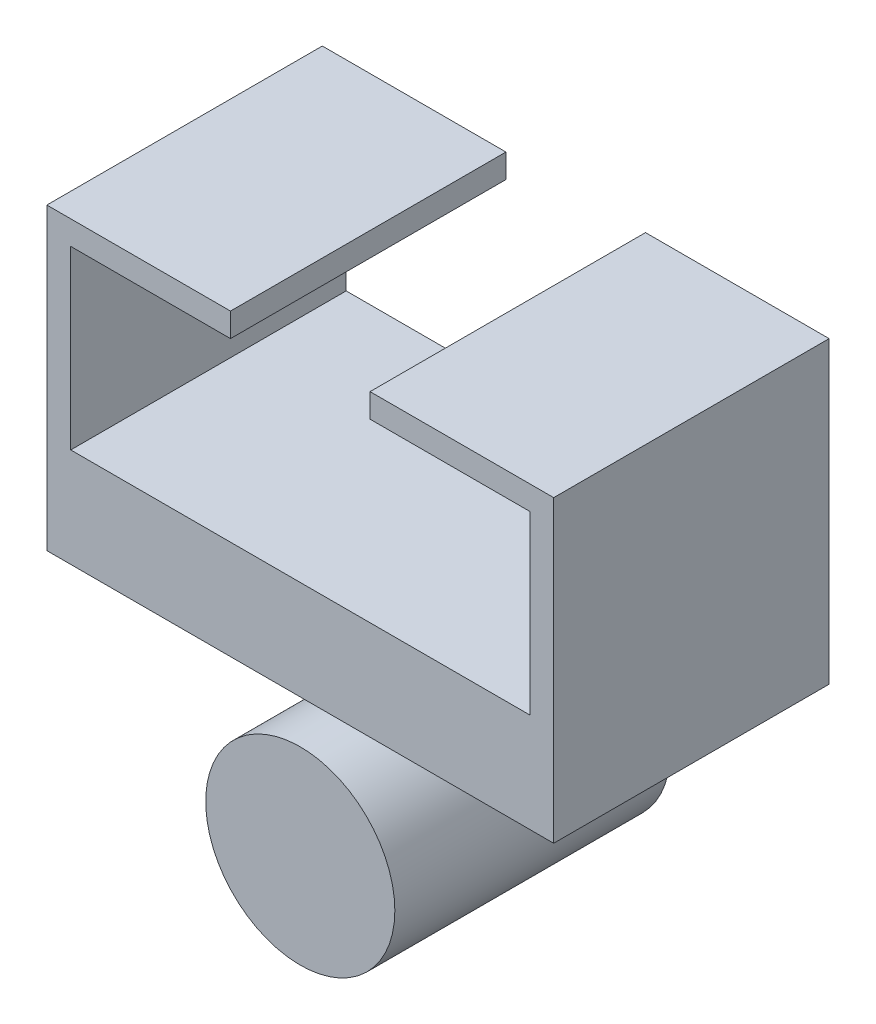
ISO-10303-21;
HEADER;
FILE_DESCRIPTION(('STEP AP214'),'2;1');
FILE_NAME('part.step','',(''),(''),'','','');
FILE_SCHEMA(('AUTOMOTIVE_DESIGN { 1 0 10303 214 1 1 1 1 }'));
ENDSEC;
DATA;
#1=APPLICATION_CONTEXT('core data for automotive mechanical design processes');
#2=APPLICATION_PROTOCOL_DEFINITION('international standard','automotive_design',2000,#1);
#3=PRODUCT_CONTEXT('',#1,'mechanical');
#4=PRODUCT('Part','Part','',(#3));
#5=PRODUCT_RELATED_PRODUCT_CATEGORY('part','',(#4));
#6=PRODUCT_DEFINITION_FORMATION('','',#4);
#7=PRODUCT_DEFINITION_CONTEXT('part definition',#1,'design');
#8=PRODUCT_DEFINITION('design','',#6,#7);
#9=PRODUCT_DEFINITION_SHAPE('','',#8);
#10=(LENGTH_UNIT() NAMED_UNIT(*) SI_UNIT(.MILLI.,.METRE.));
#11=(NAMED_UNIT(*) PLANE_ANGLE_UNIT() SI_UNIT($,.RADIAN.));
#12=(NAMED_UNIT(*) SI_UNIT($,.STERADIAN.) SOLID_ANGLE_UNIT());
#13=UNCERTAINTY_MEASURE_WITH_UNIT(LENGTH_MEASURE(1.E-05),#10,'distance_accuracy_value','');
#14=(GEOMETRIC_REPRESENTATION_CONTEXT(3) GLOBAL_UNCERTAINTY_ASSIGNED_CONTEXT((#13)) GLOBAL_UNIT_ASSIGNED_CONTEXT((#10,
#11,#12)) REPRESENTATION_CONTEXT('',''));
#15=CARTESIAN_POINT('',(0.,0.,0.));
#16=DIRECTION('',(0.,0.,1.));
#17=DIRECTION('',(1.,0.,0.));
#18=AXIS2_PLACEMENT_3D('',#15,#16,#17);
#19=CARTESIAN_POINT('',(0.,0.,38.1));
#20=DIRECTION('',(0.,0.,-1.));
#21=DIRECTION('',(-1.,0.,0.));
#22=AXIS2_PLACEMENT_3D('',#19,#20,#21);
#23=CYLINDRICAL_SURFACE('',#22,13.081);
#24=CARTESIAN_POINT('',(0.,0.,38.1));
#25=DIRECTION('',(0.,0.,1.));
#26=DIRECTION('',(1.,0.,0.));
#27=AXIS2_PLACEMENT_3D('',#24,#25,#26);
#28=CIRCLE('',#27,13.081);
#29=CARTESIAN_POINT('',(13.081,0.,38.1));
#30=VERTEX_POINT('',#29);
#31=EDGE_CURVE('E52',#30,#30,#28,.T.);
#32=ORIENTED_EDGE('',*,*,#31,.F.);
#33=EDGE_LOOP('',(#32));
#34=FACE_BOUND('',#33,.T.);
#35=CARTESIAN_POINT('',(0.,0.,3.556));
#36=DIRECTION('',(0.,0.,1.));
#37=DIRECTION('',(1.,0.,0.));
#38=AXIS2_PLACEMENT_3D('',#35,#36,#37);
#39=CIRCLE('',#38,13.081);
#40=CARTESIAN_POINT('',(13.081,0.,3.556));
#41=VERTEX_POINT('',#40);
#42=CARTESIAN_POINT('',(-13.081,0.,3.556));
#43=VERTEX_POINT('',#42);
#44=EDGE_CURVE('E11',#41,#43,#39,.T.);
#45=ORIENTED_EDGE('',*,*,#44,.T.);
#46=DIRECTION('',(0.,0.,-1.));
#47=VECTOR('',#46,1.);
#48=CARTESIAN_POINT('',(-13.081,0.,3.556));
#49=LINE('',#48,#47);
#50=CARTESIAN_POINT('',(-13.081,0.,0.));
#51=VERTEX_POINT('',#50);
#52=EDGE_CURVE('E328',#43,#51,#49,.T.);
#53=ORIENTED_EDGE('',*,*,#52,.T.);
#54=CARTESIAN_POINT('',(0.,0.,0.));
#55=DIRECTION('',(0.,0.,1.));
#56=DIRECTION('',(1.,0.,0.));
#57=AXIS2_PLACEMENT_3D('',#54,#55,#56);
#58=CIRCLE('',#57,13.081);
#59=CARTESIAN_POINT('',(13.081,0.,0.));
#60=VERTEX_POINT('',#59);
#61=EDGE_CURVE('E326',#51,#60,#58,.T.);
#62=ORIENTED_EDGE('',*,*,#61,.T.);
#63=DIRECTION('',(0.,0.,-1.));
#64=VECTOR('',#63,1.);
#65=CARTESIAN_POINT('',(13.081,0.,3.556));
#66=LINE('',#65,#64);
#67=EDGE_CURVE('E318',#41,#60,#66,.T.);
#68=ORIENTED_EDGE('',*,*,#67,.F.);
#69=EDGE_LOOP('',(#45,#53,#62,#68));
#70=FACE_BOUND('',#69,.T.);
#71=ADVANCED_FACE('F44',(#34,#70),#23,.T.);
#72=CARTESIAN_POINT('',(0.,0.,38.1));
#73=DIRECTION('',(0.,0.,1.));
#74=DIRECTION('',(1.,0.,0.));
#75=AXIS2_PLACEMENT_3D('',#72,#73,#74);
#76=PLANE('',#75);
#77=ORIENTED_EDGE('',*,*,#31,.T.);
#78=EDGE_LOOP('',(#77));
#79=FACE_BOUND('',#78,.T.);
#80=ADVANCED_FACE('F361',(#79),#76,.T.);
#81=CARTESIAN_POINT('',(0.,0.,0.));
#82=DIRECTION('',(0.,0.,1.));
#83=DIRECTION('',(1.,0.,0.));
#84=AXIS2_PLACEMENT_3D('',#81,#82,#83);
#85=PLANE('',#84);
#86=ORIENTED_EDGE('',*,*,#61,.F.);
#87=DIRECTION('',(0.,1.,0.));
#88=VECTOR('',#87,1.);
#89=CARTESIAN_POINT('',(-13.081,19.05,0.));
#90=LINE('',#89,#88);
#91=CARTESIAN_POINT('',(-13.081,19.05,0.));
#92=VERTEX_POINT('',#91);
#93=EDGE_CURVE('E313',#51,#92,#90,.T.);
#94=ORIENTED_EDGE('',*,*,#93,.T.);
#95=DIRECTION('',(-1.,0.,0.));
#96=VECTOR('',#95,1.);
#97=CARTESIAN_POINT('',(31.75,19.05,0.));
#98=LINE('',#97,#96);
#99=CARTESIAN_POINT('',(-35.052,19.05,0.));
#100=VERTEX_POINT('',#99);
#101=EDGE_CURVE('E305',#92,#100,#98,.T.);
#102=ORIENTED_EDGE('',*,*,#101,.T.);
#103=DIRECTION('',(0.,1.,0.));
#104=VECTOR('',#103,1.);
#105=CARTESIAN_POINT('',(-35.052,19.05,0.));
#106=LINE('',#105,#104);
#107=CARTESIAN_POINT('',(-35.052,60.452,0.));
#108=VERTEX_POINT('',#107);
#109=EDGE_CURVE('E172',#100,#108,#106,.T.);
#110=ORIENTED_EDGE('',*,*,#109,.T.);
#111=DIRECTION('',(1.,0.,0.));
#112=VECTOR('',#111,1.);
#113=CARTESIAN_POINT('',(-35.052,60.452,0.));
#114=LINE('',#113,#112);
#115=CARTESIAN_POINT('',(-9.652,60.452,0.));
#116=VERTEX_POINT('',#115);
#117=EDGE_CURVE('E183',#108,#116,#114,.T.);
#118=ORIENTED_EDGE('',*,*,#117,.T.);
#119=DIRECTION('',(0.,-1.,0.));
#120=VECTOR('',#119,1.);
#121=CARTESIAN_POINT('',(-9.652,60.452,0.));
#122=LINE('',#121,#120);
#123=CARTESIAN_POINT('',(-9.652,57.15,0.));
#124=VERTEX_POINT('',#123);
#125=EDGE_CURVE('E199',#116,#124,#122,.T.);
#126=ORIENTED_EDGE('',*,*,#125,.T.);
#127=DIRECTION('',(1.,0.,0.));
#128=VECTOR('',#127,1.);
#129=CARTESIAN_POINT('',(-35.052,57.15,0.));
#130=LINE('',#129,#128);
#131=CARTESIAN_POINT('',(-31.75,57.15,0.));
#132=VERTEX_POINT('',#131);
#133=EDGE_CURVE('E186',#132,#124,#130,.T.);
#134=ORIENTED_EDGE('',*,*,#133,.F.);
#135=DIRECTION('',(0.,1.,0.));
#136=VECTOR('',#135,1.);
#137=CARTESIAN_POINT('',(-31.75,19.05,0.));
#138=LINE('',#137,#136);
#139=CARTESIAN_POINT('',(-31.75,32.766,0.));
#140=VERTEX_POINT('',#139);
#141=EDGE_CURVE('E178',#140,#132,#138,.T.);
#142=ORIENTED_EDGE('',*,*,#141,.F.);
#143=DIRECTION('',(-1.,0.,0.));
#144=VECTOR('',#143,1.);
#145=CARTESIAN_POINT('',(31.75,32.766,0.));
#146=LINE('',#145,#144);
#147=CARTESIAN_POINT('',(31.75,32.766,0.));
#148=VERTEX_POINT('',#147);
#149=EDGE_CURVE('E296',#148,#140,#146,.T.);
#150=ORIENTED_EDGE('',*,*,#149,.F.);
#151=DIRECTION('',(0.,1.,0.));
#152=VECTOR('',#151,1.);
#153=CARTESIAN_POINT('',(31.75,19.05,0.));
#154=LINE('',#153,#152);
#155=CARTESIAN_POINT('',(31.75,57.15,0.));
#156=VERTEX_POINT('',#155);
#157=EDGE_CURVE('E279',#148,#156,#154,.T.);
#158=ORIENTED_EDGE('',*,*,#157,.T.);
#159=DIRECTION('',(-1.,0.,0.));
#160=VECTOR('',#159,1.);
#161=CARTESIAN_POINT('',(35.052,57.15,0.));
#162=LINE('',#161,#160);
#163=CARTESIAN_POINT('',(9.652,57.15,0.));
#164=VERTEX_POINT('',#163);
#165=EDGE_CURVE('E214',#156,#164,#162,.T.);
#166=ORIENTED_EDGE('',*,*,#165,.T.);
#167=DIRECTION('',(0.,-1.,0.));
#168=VECTOR('',#167,1.);
#169=CARTESIAN_POINT('',(9.652,60.452,0.));
#170=LINE('',#169,#168);
#171=CARTESIAN_POINT('',(9.652,60.452,0.));
#172=VERTEX_POINT('',#171);
#173=EDGE_CURVE('E245',#172,#164,#170,.T.);
#174=ORIENTED_EDGE('',*,*,#173,.F.);
#175=DIRECTION('',(-1.,0.,0.));
#176=VECTOR('',#175,1.);
#177=CARTESIAN_POINT('',(35.052,60.452,0.));
#178=LINE('',#177,#176);
#179=CARTESIAN_POINT('',(35.052,60.452,0.));
#180=VERTEX_POINT('',#179);
#181=EDGE_CURVE('E219',#180,#172,#178,.T.);
#182=ORIENTED_EDGE('',*,*,#181,.F.);
#183=DIRECTION('',(0.,1.,0.));
#184=VECTOR('',#183,1.);
#185=CARTESIAN_POINT('',(35.052,19.05,0.));
#186=LINE('',#185,#184);
#187=CARTESIAN_POINT('',(35.052,19.05,0.));
#188=VERTEX_POINT('',#187);
#189=EDGE_CURVE('E271',#188,#180,#186,.T.);
#190=ORIENTED_EDGE('',*,*,#189,.F.);
#191=CARTESIAN_POINT('',(13.081,19.05,0.));
#192=VERTEX_POINT('',#191);
#193=EDGE_CURVE('E290',#188,#192,#98,.T.);
#194=ORIENTED_EDGE('',*,*,#193,.T.);
#195=DIRECTION('',(0.,-1.,0.));
#196=VECTOR('',#195,1.);
#197=CARTESIAN_POINT('',(13.081,19.05,0.));
#198=LINE('',#197,#196);
#199=EDGE_CURVE('E303',#192,#60,#198,.T.);
#200=ORIENTED_EDGE('',*,*,#199,.T.);
#201=EDGE_LOOP('',(#86,#94,#102,#110,#118,#126,#134,#142,#150,#158,#166,#174,#182,#190,#194,#200));
#202=FACE_BOUND('',#201,.T.);
#203=ADVANCED_FACE('F342',(#202),#85,.F.);
#204=CARTESIAN_POINT('',(13.081,19.05,3.556));
#205=DIRECTION('',(1.,0.,0.));
#206=DIRECTION('',(0.,1.,0.));
#207=AXIS2_PLACEMENT_3D('',#204,#205,#206);
#208=PLANE('',#207);
#209=ORIENTED_EDGE('',*,*,#199,.F.);
#210=DIRECTION('',(0.,0.,-1.));
#211=VECTOR('',#210,1.);
#212=CARTESIAN_POINT('',(13.081,19.05,3.556));
#213=LINE('',#212,#211);
#214=CARTESIAN_POINT('',(13.081,19.05,3.556));
#215=VERTEX_POINT('',#214);
#216=EDGE_CURVE('E70',#215,#192,#213,.T.);
#217=ORIENTED_EDGE('',*,*,#216,.F.);
#218=DIRECTION('',(0.,-1.,0.));
#219=VECTOR('',#218,1.);
#220=CARTESIAN_POINT('',(13.081,19.05,3.556));
#221=LINE('',#220,#219);
#222=EDGE_CURVE('E306',#215,#41,#221,.T.);
#223=ORIENTED_EDGE('',*,*,#222,.T.);
#224=ORIENTED_EDGE('',*,*,#67,.T.);
#225=EDGE_LOOP('',(#209,#217,#223,#224));
#226=FACE_BOUND('',#225,.T.);
#227=ADVANCED_FACE('F347',(#226),#208,.T.);
#228=CARTESIAN_POINT('',(-13.081,19.05,3.556));
#229=DIRECTION('',(-1.,0.,0.));
#230=DIRECTION('',(0.,-1.,0.));
#231=AXIS2_PLACEMENT_3D('',#228,#229,#230);
#232=PLANE('',#231);
#233=ORIENTED_EDGE('',*,*,#93,.F.);
#234=ORIENTED_EDGE('',*,*,#52,.F.);
#235=DIRECTION('',(0.,1.,0.));
#236=VECTOR('',#235,1.);
#237=CARTESIAN_POINT('',(-13.081,19.05,3.556));
#238=LINE('',#237,#236);
#239=CARTESIAN_POINT('',(-13.081,19.05,3.556));
#240=VERTEX_POINT('',#239);
#241=EDGE_CURVE('E58',#43,#240,#238,.T.);
#242=ORIENTED_EDGE('',*,*,#241,.T.);
#243=DIRECTION('',(0.,0.,-1.));
#244=VECTOR('',#243,1.);
#245=CARTESIAN_POINT('',(-13.081,19.05,3.556));
#246=LINE('',#245,#244);
#247=EDGE_CURVE('E81',#240,#92,#246,.T.);
#248=ORIENTED_EDGE('',*,*,#247,.T.);
#249=EDGE_LOOP('',(#233,#234,#242,#248));
#250=FACE_BOUND('',#249,.T.);
#251=ADVANCED_FACE('F351',(#250),#232,.T.);
#252=CARTESIAN_POINT('',(0.,0.,3.556));
#253=DIRECTION('',(0.,0.,1.));
#254=DIRECTION('',(1.,0.,0.));
#255=AXIS2_PLACEMENT_3D('',#252,#253,#254);
#256=PLANE('',#255);
#257=ORIENTED_EDGE('',*,*,#44,.F.);
#258=ORIENTED_EDGE('',*,*,#222,.F.);
#259=DIRECTION('',(1.,0.,0.));
#260=VECTOR('',#259,1.);
#261=CARTESIAN_POINT('',(-13.081,19.05,3.556));
#262=LINE('',#261,#260);
#263=EDGE_CURVE('E314',#240,#215,#262,.T.);
#264=ORIENTED_EDGE('',*,*,#263,.F.);
#265=ORIENTED_EDGE('',*,*,#241,.F.);
#266=EDGE_LOOP('',(#257,#258,#264,#265));
#267=FACE_BOUND('',#266,.T.);
#268=ADVANCED_FACE('F348',(#267),#256,.T.);
#269=CARTESIAN_POINT('',(31.75,32.766,38.1));
#270=DIRECTION('',(0.,0.,-1.));
#271=DIRECTION('',(-1.,0.,0.));
#272=AXIS2_PLACEMENT_3D('',#269,#270,#271);
#273=PLANE('',#272);
#274=DIRECTION('',(1.,0.,0.));
#275=VECTOR('',#274,1.);
#276=CARTESIAN_POINT('',(31.75,19.05,38.1));
#277=LINE('',#276,#275);
#278=CARTESIAN_POINT('',(-35.052,19.05,38.1));
#279=VERTEX_POINT('',#278);
#280=CARTESIAN_POINT('',(35.052,19.05,38.1));
#281=VERTEX_POINT('',#280);
#282=EDGE_CURVE('E273',#279,#281,#277,.T.);
#283=ORIENTED_EDGE('',*,*,#282,.T.);
#284=DIRECTION('',(0.,-1.,0.));
#285=VECTOR('',#284,1.);
#286=CARTESIAN_POINT('',(35.052,19.05,38.1));
#287=LINE('',#286,#285);
#288=CARTESIAN_POINT('',(35.052,60.452,38.1));
#289=VERTEX_POINT('',#288);
#290=EDGE_CURVE('E265',#289,#281,#287,.T.);
#291=ORIENTED_EDGE('',*,*,#290,.F.);
#292=DIRECTION('',(1.,0.,0.));
#293=VECTOR('',#292,1.);
#294=CARTESIAN_POINT('',(35.052,60.452,38.1));
#295=LINE('',#294,#293);
#296=CARTESIAN_POINT('',(9.652,60.452,38.1));
#297=VERTEX_POINT('',#296);
#298=EDGE_CURVE('E226',#297,#289,#295,.T.);
#299=ORIENTED_EDGE('',*,*,#298,.F.);
#300=DIRECTION('',(0.,-1.,0.));
#301=VECTOR('',#300,1.);
#302=CARTESIAN_POINT('',(9.652,60.452,38.1));
#303=LINE('',#302,#301);
#304=CARTESIAN_POINT('',(9.652,57.15,38.1));
#305=VERTEX_POINT('',#304);
#306=EDGE_CURVE('E233',#297,#305,#303,.T.);
#307=ORIENTED_EDGE('',*,*,#306,.T.);
#308=DIRECTION('',(1.,0.,0.));
#309=VECTOR('',#308,1.);
#310=CARTESIAN_POINT('',(35.052,57.15,38.1));
#311=LINE('',#310,#309);
#312=CARTESIAN_POINT('',(31.75,57.15,38.1));
#313=VERTEX_POINT('',#312);
#314=EDGE_CURVE('E222',#305,#313,#311,.T.);
#315=ORIENTED_EDGE('',*,*,#314,.T.);
#316=DIRECTION('',(0.,-1.,0.));
#317=VECTOR('',#316,1.);
#318=CARTESIAN_POINT('',(31.75,19.05,38.1));
#319=LINE('',#318,#317);
#320=CARTESIAN_POINT('',(31.75,32.766,38.1));
#321=VERTEX_POINT('',#320);
#322=EDGE_CURVE('E252',#313,#321,#319,.T.);
#323=ORIENTED_EDGE('',*,*,#322,.T.);
#324=DIRECTION('',(1.,0.,0.));
#325=VECTOR('',#324,1.);
#326=CARTESIAN_POINT('',(31.75,32.766,38.1));
#327=LINE('',#326,#325);
#328=CARTESIAN_POINT('',(-31.75,32.766,38.1));
#329=VERTEX_POINT('',#328);
#330=EDGE_CURVE('E287',#329,#321,#327,.T.);
#331=ORIENTED_EDGE('',*,*,#330,.F.);
#332=DIRECTION('',(0.,-1.,0.));
#333=VECTOR('',#332,1.);
#334=CARTESIAN_POINT('',(-31.75,19.05,38.1));
#335=LINE('',#334,#333);
#336=CARTESIAN_POINT('',(-31.75,57.15,38.1));
#337=VERTEX_POINT('',#336);
#338=EDGE_CURVE('E248',#337,#329,#335,.T.);
#339=ORIENTED_EDGE('',*,*,#338,.F.);
#340=DIRECTION('',(-1.,0.,0.));
#341=VECTOR('',#340,1.);
#342=CARTESIAN_POINT('',(-35.052,57.15,38.1));
#343=LINE('',#342,#341);
#344=CARTESIAN_POINT('',(-9.652,57.15,38.1));
#345=VERTEX_POINT('',#344);
#346=EDGE_CURVE('E203',#345,#337,#343,.T.);
#347=ORIENTED_EDGE('',*,*,#346,.F.);
#348=DIRECTION('',(0.,-1.,0.));
#349=VECTOR('',#348,1.);
#350=CARTESIAN_POINT('',(-9.652,60.452,38.1));
#351=LINE('',#350,#349);
#352=CARTESIAN_POINT('',(-9.652,60.452,38.1));
#353=VERTEX_POINT('',#352);
#354=EDGE_CURVE('E193',#353,#345,#351,.T.);
#355=ORIENTED_EDGE('',*,*,#354,.F.);
#356=DIRECTION('',(-1.,0.,0.));
#357=VECTOR('',#356,1.);
#358=CARTESIAN_POINT('',(-35.052,60.452,38.1));
#359=LINE('',#358,#357);
#360=CARTESIAN_POINT('',(-35.052,60.452,38.1));
#361=VERTEX_POINT('',#360);
#362=EDGE_CURVE('E185',#353,#361,#359,.T.);
#363=ORIENTED_EDGE('',*,*,#362,.T.);
#364=DIRECTION('',(0.,-1.,0.));
#365=VECTOR('',#364,1.);
#366=CARTESIAN_POINT('',(-35.052,19.05,38.1));
#367=LINE('',#366,#365);
#368=EDGE_CURVE('E163',#361,#279,#367,.T.);
#369=ORIENTED_EDGE('',*,*,#368,.T.);
#370=EDGE_LOOP('',(#283,#291,#299,#307,#315,#323,#331,#339,#347,#355,#363,#369));
#371=FACE_BOUND('',#370,.T.);
#372=ADVANCED_FACE('F188',(#371),#273,.F.);
#373=CARTESIAN_POINT('',(0.,32.766,0.));
#374=DIRECTION('',(0.,1.,0.));
#375=DIRECTION('',(0.,0.,1.));
#376=AXIS2_PLACEMENT_3D('',#373,#374,#375);
#377=PLANE('',#376);
#378=DIRECTION('',(0.,0.,1.));
#379=VECTOR('',#378,1.);
#380=CARTESIAN_POINT('',(-31.75,32.766,38.1));
#381=LINE('',#380,#379);
#382=EDGE_CURVE('E283',#140,#329,#381,.T.);
#383=ORIENTED_EDGE('',*,*,#382,.T.);
#384=ORIENTED_EDGE('',*,*,#330,.T.);
#385=DIRECTION('',(0.,0.,-1.));
#386=VECTOR('',#385,1.);
#387=CARTESIAN_POINT('',(31.75,32.766,38.1));
#388=LINE('',#387,#386);
#389=EDGE_CURVE('E291',#321,#148,#388,.T.);
#390=ORIENTED_EDGE('',*,*,#389,.T.);
#391=ORIENTED_EDGE('',*,*,#149,.T.);
#392=EDGE_LOOP('',(#383,#384,#390,#391));
#393=FACE_BOUND('',#392,.T.);
#394=ADVANCED_FACE('F360',(#393),#377,.T.);
#395=CARTESIAN_POINT('',(0.,19.05,0.));
#396=DIRECTION('',(0.,1.,0.));
#397=DIRECTION('',(0.,0.,1.));
#398=AXIS2_PLACEMENT_3D('',#395,#396,#397);
#399=PLANE('',#398);
#400=ORIENTED_EDGE('',*,*,#247,.F.);
#401=ORIENTED_EDGE('',*,*,#263,.T.);
#402=ORIENTED_EDGE('',*,*,#216,.T.);
#403=ORIENTED_EDGE('',*,*,#193,.F.);
#404=DIRECTION('',(0.,0.,-1.));
#405=VECTOR('',#404,1.);
#406=CARTESIAN_POINT('',(35.052,19.05,38.1));
#407=LINE('',#406,#405);
#408=EDGE_CURVE('E266',#281,#188,#407,.T.);
#409=ORIENTED_EDGE('',*,*,#408,.F.);
#410=ORIENTED_EDGE('',*,*,#282,.F.);
#411=DIRECTION('',(0.,0.,-1.));
#412=VECTOR('',#411,1.);
#413=CARTESIAN_POINT('',(-35.052,19.05,38.1));
#414=LINE('',#413,#412);
#415=EDGE_CURVE('E174',#279,#100,#414,.T.);
#416=ORIENTED_EDGE('',*,*,#415,.T.);
#417=ORIENTED_EDGE('',*,*,#101,.F.);
#418=EDGE_LOOP('',(#400,#401,#402,#403,#409,#410,#416,#417));
#419=FACE_BOUND('',#418,.T.);
#420=ADVANCED_FACE('F346',(#419),#399,.F.);
#421=CARTESIAN_POINT('',(31.75,0.,0.));
#422=DIRECTION('',(-1.,0.,0.));
#423=DIRECTION('',(0.,0.,1.));
#424=AXIS2_PLACEMENT_3D('',#421,#422,#423);
#425=PLANE('',#424);
#426=ORIENTED_EDGE('',*,*,#389,.F.);
#427=ORIENTED_EDGE('',*,*,#322,.F.);
#428=DIRECTION('',(0.,0.,1.));
#429=VECTOR('',#428,1.);
#430=CARTESIAN_POINT('',(31.75,57.15,38.1));
#431=LINE('',#430,#429);
#432=EDGE_CURVE('E270',#156,#313,#431,.T.);
#433=ORIENTED_EDGE('',*,*,#432,.F.);
#434=ORIENTED_EDGE('',*,*,#157,.F.);
#435=EDGE_LOOP('',(#426,#427,#433,#434));
#436=FACE_BOUND('',#435,.T.);
#437=ADVANCED_FACE('F422',(#436),#425,.T.);
#438=CARTESIAN_POINT('',(35.052,0.,0.));
#439=DIRECTION('',(-1.,0.,0.));
#440=DIRECTION('',(0.,0.,1.));
#441=AXIS2_PLACEMENT_3D('',#438,#439,#440);
#442=PLANE('',#441);
#443=ORIENTED_EDGE('',*,*,#290,.T.);
#444=ORIENTED_EDGE('',*,*,#408,.T.);
#445=ORIENTED_EDGE('',*,*,#189,.T.);
#446=DIRECTION('',(0.,0.,-1.));
#447=VECTOR('',#446,1.);
#448=CARTESIAN_POINT('',(35.052,60.452,38.1));
#449=LINE('',#448,#447);
#450=EDGE_CURVE('E216',#289,#180,#449,.T.);
#451=ORIENTED_EDGE('',*,*,#450,.F.);
#452=EDGE_LOOP('',(#443,#444,#445,#451));
#453=FACE_BOUND('',#452,.T.);
#454=ADVANCED_FACE('F439',(#453),#442,.F.);
#455=CARTESIAN_POINT('',(-31.75,0.,0.));
#456=DIRECTION('',(1.,0.,0.));
#457=DIRECTION('',(0.,0.,1.));
#458=AXIS2_PLACEMENT_3D('',#455,#456,#457);
#459=PLANE('',#458);
#460=ORIENTED_EDGE('',*,*,#382,.F.);
#461=ORIENTED_EDGE('',*,*,#141,.T.);
#462=DIRECTION('',(0.,0.,1.));
#463=VECTOR('',#462,1.);
#464=CARTESIAN_POINT('',(-31.75,57.15,38.1));
#465=LINE('',#464,#463);
#466=EDGE_CURVE('E254',#132,#337,#465,.T.);
#467=ORIENTED_EDGE('',*,*,#466,.T.);
#468=ORIENTED_EDGE('',*,*,#338,.T.);
#469=EDGE_LOOP('',(#460,#461,#467,#468));
#470=FACE_BOUND('',#469,.T.);
#471=ADVANCED_FACE('F447',(#470),#459,.T.);
#472=CARTESIAN_POINT('',(-35.052,0.,0.));
#473=DIRECTION('',(1.,0.,0.));
#474=DIRECTION('',(0.,0.,1.));
#475=AXIS2_PLACEMENT_3D('',#472,#473,#474);
#476=PLANE('',#475);
#477=ORIENTED_EDGE('',*,*,#368,.F.);
#478=DIRECTION('',(0.,0.,-1.));
#479=VECTOR('',#478,1.);
#480=CARTESIAN_POINT('',(-35.052,60.452,38.1));
#481=LINE('',#480,#479);
#482=EDGE_CURVE('E169',#361,#108,#481,.T.);
#483=ORIENTED_EDGE('',*,*,#482,.T.);
#484=ORIENTED_EDGE('',*,*,#109,.F.);
#485=ORIENTED_EDGE('',*,*,#415,.F.);
#486=EDGE_LOOP('',(#477,#483,#484,#485));
#487=FACE_BOUND('',#486,.T.);
#488=ADVANCED_FACE('F167',(#487),#476,.F.);
#489=CARTESIAN_POINT('',(0.,57.15,0.));
#490=DIRECTION('',(0.,1.,0.));
#491=DIRECTION('',(0.,0.,1.));
#492=AXIS2_PLACEMENT_3D('',#489,#490,#491);
#493=PLANE('',#492);
#494=ORIENTED_EDGE('',*,*,#165,.F.);
#495=ORIENTED_EDGE('',*,*,#432,.T.);
#496=ORIENTED_EDGE('',*,*,#314,.F.);
#497=DIRECTION('',(0.,0.,1.));
#498=VECTOR('',#497,1.);
#499=CARTESIAN_POINT('',(9.652,57.15,38.1));
#500=LINE('',#499,#498);
#501=EDGE_CURVE('E235',#164,#305,#500,.T.);
#502=ORIENTED_EDGE('',*,*,#501,.F.);
#503=EDGE_LOOP('',(#494,#495,#496,#502));
#504=FACE_BOUND('',#503,.T.);
#505=ADVANCED_FACE('F483',(#504),#493,.F.);
#506=CARTESIAN_POINT('',(9.652,60.452,38.1));
#507=DIRECTION('',(1.,0.,0.));
#508=DIRECTION('',(0.,0.,-1.));
#509=AXIS2_PLACEMENT_3D('',#506,#507,#508);
#510=PLANE('',#509);
#511=ORIENTED_EDGE('',*,*,#501,.T.);
#512=ORIENTED_EDGE('',*,*,#306,.F.);
#513=DIRECTION('',(0.,0.,1.));
#514=VECTOR('',#513,1.);
#515=CARTESIAN_POINT('',(9.652,60.452,38.1));
#516=LINE('',#515,#514);
#517=EDGE_CURVE('E221',#172,#297,#516,.T.);
#518=ORIENTED_EDGE('',*,*,#517,.F.);
#519=ORIENTED_EDGE('',*,*,#173,.T.);
#520=EDGE_LOOP('',(#511,#512,#518,#519));
#521=FACE_BOUND('',#520,.T.);
#522=ADVANCED_FACE('F523',(#521),#510,.F.);
#523=CARTESIAN_POINT('',(0.,60.452,0.));
#524=DIRECTION('',(0.,1.,0.));
#525=DIRECTION('',(0.,0.,1.));
#526=AXIS2_PLACEMENT_3D('',#523,#524,#525);
#527=PLANE('',#526);
#528=ORIENTED_EDGE('',*,*,#450,.T.);
#529=ORIENTED_EDGE('',*,*,#181,.T.);
#530=ORIENTED_EDGE('',*,*,#517,.T.);
#531=ORIENTED_EDGE('',*,*,#298,.T.);
#532=EDGE_LOOP('',(#528,#529,#530,#531));
#533=FACE_BOUND('',#532,.T.);
#534=ADVANCED_FACE('F494',(#533),#527,.T.);
#535=CARTESIAN_POINT('',(-9.652,60.452,38.1));
#536=DIRECTION('',(1.,0.,0.));
#537=DIRECTION('',(0.,0.,-1.));
#538=AXIS2_PLACEMENT_3D('',#535,#536,#537);
#539=PLANE('',#538);
#540=DIRECTION('',(0.,0.,1.));
#541=VECTOR('',#540,1.);
#542=CARTESIAN_POINT('',(-9.652,57.15,38.1));
#543=LINE('',#542,#541);
#544=EDGE_CURVE('E204',#124,#345,#543,.T.);
#545=ORIENTED_EDGE('',*,*,#544,.F.);
#546=ORIENTED_EDGE('',*,*,#125,.F.);
#547=DIRECTION('',(0.,0.,1.));
#548=VECTOR('',#547,1.);
#549=CARTESIAN_POINT('',(-9.652,60.452,38.1));
#550=LINE('',#549,#548);
#551=EDGE_CURVE('E192',#116,#353,#550,.T.);
#552=ORIENTED_EDGE('',*,*,#551,.T.);
#553=ORIENTED_EDGE('',*,*,#354,.T.);
#554=EDGE_LOOP('',(#545,#546,#552,#553));
#555=FACE_BOUND('',#554,.T.);
#556=ADVANCED_FACE('F489',(#555),#539,.T.);
#557=CARTESIAN_POINT('',(0.,60.452,0.));
#558=DIRECTION('',(0.,1.,0.));
#559=DIRECTION('',(0.,0.,1.));
#560=AXIS2_PLACEMENT_3D('',#557,#558,#559);
#561=PLANE('',#560);
#562=ORIENTED_EDGE('',*,*,#482,.F.);
#563=ORIENTED_EDGE('',*,*,#362,.F.);
#564=ORIENTED_EDGE('',*,*,#551,.F.);
#565=ORIENTED_EDGE('',*,*,#117,.F.);
#566=EDGE_LOOP('',(#562,#563,#564,#565));
#567=FACE_BOUND('',#566,.T.);
#568=ADVANCED_FACE('F176',(#567),#561,.T.);
#569=CARTESIAN_POINT('',(0.,57.15,0.));
#570=DIRECTION('',(0.,1.,0.));
#571=DIRECTION('',(0.,0.,1.));
#572=AXIS2_PLACEMENT_3D('',#569,#570,#571);
#573=PLANE('',#572);
#574=ORIENTED_EDGE('',*,*,#466,.F.);
#575=ORIENTED_EDGE('',*,*,#133,.T.);
#576=ORIENTED_EDGE('',*,*,#544,.T.);
#577=ORIENTED_EDGE('',*,*,#346,.T.);
#578=EDGE_LOOP('',(#574,#575,#576,#577));
#579=FACE_BOUND('',#578,.T.);
#580=ADVANCED_FACE('F508',(#579),#573,.F.);
#581=CLOSED_SHELL('',(#71,#80,#203,#227,#251,#268,#372,#394,#420,#437,#454,#471,#488,#505,#522,
#534,#556,#568,#580));
#582=MANIFOLD_SOLID_BREP('B2',#581);
#583=ADVANCED_BREP_SHAPE_REPRESENTATION('',(#18,#582),#14);
#584=SHAPE_DEFINITION_REPRESENTATION(#9,#583);
ENDSEC;
END-ISO-10303-21;
